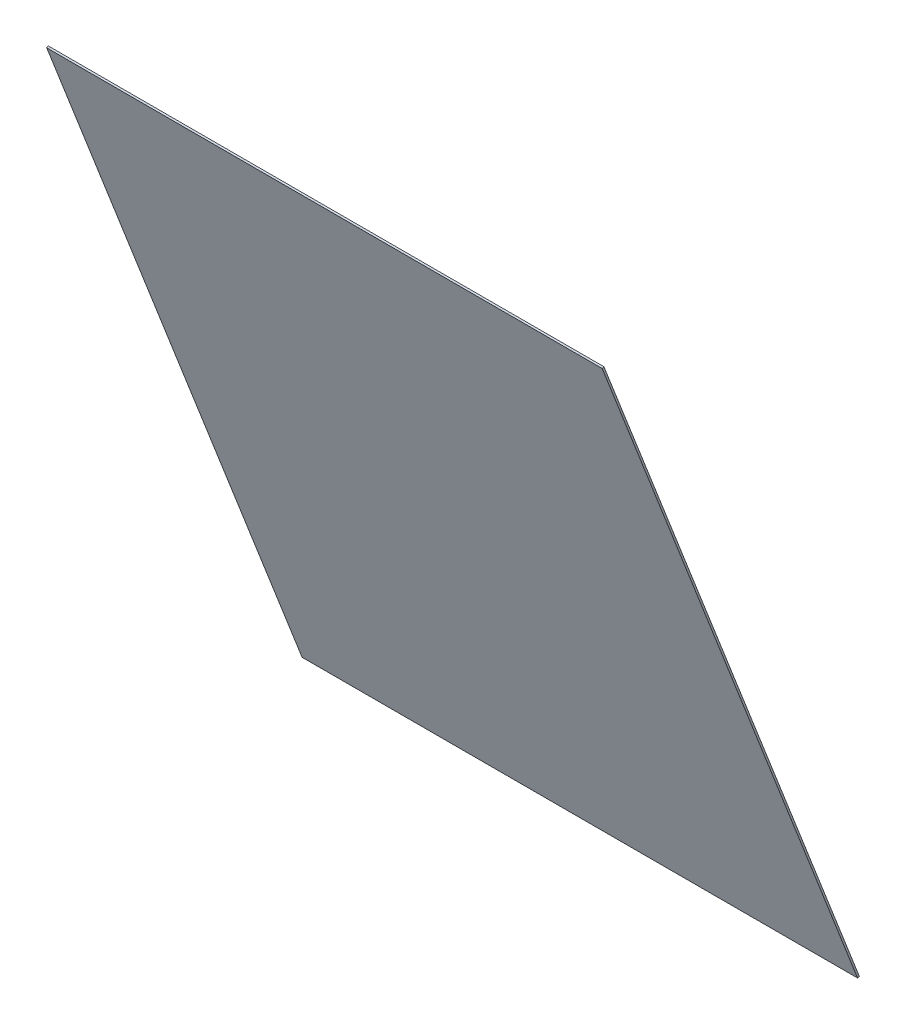
ISO-10303-21;
HEADER;
FILE_DESCRIPTION(('STEP AP214'),'2;1');
FILE_NAME('part.step','',(''),(''),'','','');
FILE_SCHEMA(('AUTOMOTIVE_DESIGN { 1 0 10303 214 1 1 1 1 }'));
ENDSEC;
DATA;
#1=APPLICATION_CONTEXT('core data for automotive mechanical design processes');
#2=APPLICATION_PROTOCOL_DEFINITION('international standard','automotive_design',2000,#1);
#3=PRODUCT_CONTEXT('',#1,'mechanical');
#4=PRODUCT('Part','Part','',(#3));
#5=PRODUCT_RELATED_PRODUCT_CATEGORY('part','',(#4));
#6=PRODUCT_DEFINITION_FORMATION('','',#4);
#7=PRODUCT_DEFINITION_CONTEXT('part definition',#1,'design');
#8=PRODUCT_DEFINITION('design','',#6,#7);
#9=PRODUCT_DEFINITION_SHAPE('','',#8);
#10=(LENGTH_UNIT() NAMED_UNIT(*) SI_UNIT(.MILLI.,.METRE.));
#11=(NAMED_UNIT(*) PLANE_ANGLE_UNIT() SI_UNIT($,.RADIAN.));
#12=(NAMED_UNIT(*) SI_UNIT($,.STERADIAN.) SOLID_ANGLE_UNIT());
#13=UNCERTAINTY_MEASURE_WITH_UNIT(LENGTH_MEASURE(1.E-05),#10,'distance_accuracy_value','');
#14=(GEOMETRIC_REPRESENTATION_CONTEXT(3) GLOBAL_UNCERTAINTY_ASSIGNED_CONTEXT((#13)) GLOBAL_UNIT_ASSIGNED_CONTEXT((#10,
#11,#12)) REPRESENTATION_CONTEXT('',''));
#15=CARTESIAN_POINT('',(0.,0.,0.));
#16=DIRECTION('',(0.,0.,1.));
#17=DIRECTION('',(1.,0.,0.));
#18=AXIS2_PLACEMENT_3D('',#15,#16,#17);
#19=CARTESIAN_POINT('',(0.,39.0189813535358,-50.3039006097775));
#20=DIRECTION('',(-1.,0.,0.));
#21=DIRECTION('',(0.,-0.931790995018928,-0.362995236334632));
#22=AXIS2_PLACEMENT_3D('',#19,#20,#21);
#23=PLANE('',#22);
#24=DIRECTION('',(0.,-0.362995236334632,0.931790995018928));
#25=VECTOR('',#24,1.);
#26=CARTESIAN_POINT('',(0.,39.0189813535358,-50.3039006097775));
#27=LINE('',#26,#25);
#28=CARTESIAN_POINT('',(0.,39.0552808771692,-50.3970797092794));
#29=VERTEX_POINT('',#28);
#30=CARTESIAN_POINT('',(0.,39.0189813535358,-50.3039006097775));
#31=VERTEX_POINT('',#30);
#32=EDGE_CURVE('E11',#29,#31,#27,.T.);
#33=ORIENTED_EDGE('',*,*,#32,.F.);
#34=DIRECTION('',(0.,-0.931790995018928,-0.362995236334632));
#35=VECTOR('',#34,1.);
#36=CARTESIAN_POINT('',(0.,39.0552808771692,-50.3970797092794));
#37=LINE('',#36,#35);
#38=CARTESIAN_POINT('',(0.,3.65028830108417,-64.1897045750314));
#39=VERTEX_POINT('',#38);
#40=EDGE_CURVE('E88',#29,#39,#37,.T.);
#41=ORIENTED_EDGE('',*,*,#40,.T.);
#42=DIRECTION('',(0.,-0.362995236334632,0.931790995018928));
#43=VECTOR('',#42,1.);
#44=CARTESIAN_POINT('',(0.,3.6139887774507,-64.0965254755295));
#45=LINE('',#44,#43);
#46=CARTESIAN_POINT('',(0.,3.6139887774507,-64.0965254755295));
#47=VERTEX_POINT('',#46);
#48=EDGE_CURVE('E43',#39,#47,#45,.T.);
#49=ORIENTED_EDGE('',*,*,#48,.T.);
#50=DIRECTION('',(0.,-0.931790995018928,-0.362995236334632));
#51=VECTOR('',#50,1.);
#52=CARTESIAN_POINT('',(0.,39.0189813535358,-50.3039006097775));
#53=LINE('',#52,#51);
#54=EDGE_CURVE('E101',#31,#47,#53,.T.);
#55=ORIENTED_EDGE('',*,*,#54,.F.);
#56=EDGE_LOOP('',(#33,#41,#49,#55));
#57=FACE_BOUND('',#56,.T.);
#58=ADVANCED_FACE('F33',(#57),#23,.T.);
#59=CARTESIAN_POINT('',(0.,3.6139887774507,-64.0965254755295));
#60=DIRECTION('',(0.,-0.931790995018928,-0.362995236334632));
#61=DIRECTION('',(1.,0.,0.));
#62=AXIS2_PLACEMENT_3D('',#59,#60,#61);
#63=PLANE('',#62);
#64=ORIENTED_EDGE('',*,*,#48,.F.);
#65=DIRECTION('',(1.,0.,0.));
#66=VECTOR('',#65,1.);
#67=CARTESIAN_POINT('',(0.,3.65028830108417,-64.1897045750314));
#68=LINE('',#67,#66);
#69=CARTESIAN_POINT('',(30.,3.65028830108417,-64.1897045750314));
#70=VERTEX_POINT('',#69);
#71=EDGE_CURVE('E95',#39,#70,#68,.T.);
#72=ORIENTED_EDGE('',*,*,#71,.T.);
#73=DIRECTION('',(0.,-0.362995236334632,0.931790995018928));
#74=VECTOR('',#73,1.);
#75=CARTESIAN_POINT('',(30.,3.6139887774507,-64.0965254755295));
#76=LINE('',#75,#74);
#77=CARTESIAN_POINT('',(30.,3.6139887774507,-64.0965254755295));
#78=VERTEX_POINT('',#77);
#79=EDGE_CURVE('E51',#70,#78,#76,.T.);
#80=ORIENTED_EDGE('',*,*,#79,.T.);
#81=DIRECTION('',(1.,0.,0.));
#82=VECTOR('',#81,1.);
#83=CARTESIAN_POINT('',(0.,3.6139887774507,-64.0965254755295));
#84=LINE('',#83,#82);
#85=EDGE_CURVE('E82',#47,#78,#84,.T.);
#86=ORIENTED_EDGE('',*,*,#85,.F.);
#87=EDGE_LOOP('',(#64,#72,#80,#86));
#88=FACE_BOUND('',#87,.T.);
#89=ADVANCED_FACE('F105',(#88),#63,.T.);
#90=CARTESIAN_POINT('',(30.,39.0189813535358,-50.3039006097775));
#91=DIRECTION('',(-1.,0.,0.));
#92=DIRECTION('',(0.,-0.931790995018928,-0.362995236334632));
#93=AXIS2_PLACEMENT_3D('',#90,#91,#92);
#94=PLANE('',#93);
#95=ORIENTED_EDGE('',*,*,#79,.F.);
#96=DIRECTION('',(0.,-0.931790995018928,-0.362995236334632));
#97=VECTOR('',#96,1.);
#98=CARTESIAN_POINT('',(30.,39.0552808771692,-50.3970797092794));
#99=LINE('',#98,#97);
#100=CARTESIAN_POINT('',(30.,39.0552808771692,-50.3970797092794));
#101=VERTEX_POINT('',#100);
#102=EDGE_CURVE('E87',#101,#70,#99,.T.);
#103=ORIENTED_EDGE('',*,*,#102,.F.);
#104=DIRECTION('',(0.,-0.362995236334632,0.931790995018928));
#105=VECTOR('',#104,1.);
#106=CARTESIAN_POINT('',(30.,39.0189813535358,-50.3039006097775));
#107=LINE('',#106,#105);
#108=CARTESIAN_POINT('',(30.,39.0189813535358,-50.3039006097775));
#109=VERTEX_POINT('',#108);
#110=EDGE_CURVE('E37',#101,#109,#107,.T.);
#111=ORIENTED_EDGE('',*,*,#110,.T.);
#112=DIRECTION('',(0.,-0.931790995018928,-0.362995236334632));
#113=VECTOR('',#112,1.);
#114=CARTESIAN_POINT('',(30.,39.0189813535358,-50.3039006097775));
#115=LINE('',#114,#113);
#116=EDGE_CURVE('E97',#109,#78,#115,.T.);
#117=ORIENTED_EDGE('',*,*,#116,.T.);
#118=EDGE_LOOP('',(#95,#103,#111,#117));
#119=FACE_BOUND('',#118,.T.);
#120=ADVANCED_FACE('F90',(#119),#94,.F.);
#121=CARTESIAN_POINT('',(0.,39.0189813535358,-50.3039006097775));
#122=DIRECTION('',(0.,-0.931790995018928,-0.362995236334632));
#123=DIRECTION('',(1.,0.,0.));
#124=AXIS2_PLACEMENT_3D('',#121,#122,#123);
#125=PLANE('',#124);
#126=DIRECTION('',(1.,0.,0.));
#127=VECTOR('',#126,1.);
#128=CARTESIAN_POINT('',(0.,39.0552808771692,-50.3970797092794));
#129=LINE('',#128,#127);
#130=EDGE_CURVE('E76',#29,#101,#129,.T.);
#131=ORIENTED_EDGE('',*,*,#130,.F.);
#132=ORIENTED_EDGE('',*,*,#32,.T.);
#133=DIRECTION('',(1.,0.,0.));
#134=VECTOR('',#133,1.);
#135=CARTESIAN_POINT('',(0.,39.0189813535358,-50.3039006097775));
#136=LINE('',#135,#134);
#137=EDGE_CURVE('E78',#31,#109,#136,.T.);
#138=ORIENTED_EDGE('',*,*,#137,.T.);
#139=ORIENTED_EDGE('',*,*,#110,.F.);
#140=EDGE_LOOP('',(#131,#132,#138,#139));
#141=FACE_BOUND('',#140,.T.);
#142=ADVANCED_FACE('F35',(#141),#125,.F.);
#143=CARTESIAN_POINT('',(0.,39.0189813535358,-50.3039006097775));
#144=DIRECTION('',(0.,-0.362995236334632,0.931790995018928));
#145=DIRECTION('',(0.,-0.931790995018928,-0.362995236334632));
#146=AXIS2_PLACEMENT_3D('',#143,#144,#145);
#147=PLANE('',#146);
#148=ORIENTED_EDGE('',*,*,#116,.F.);
#149=ORIENTED_EDGE('',*,*,#137,.F.);
#150=ORIENTED_EDGE('',*,*,#54,.T.);
#151=ORIENTED_EDGE('',*,*,#85,.T.);
#152=EDGE_LOOP('',(#148,#149,#150,#151));
#153=FACE_BOUND('',#152,.T.);
#154=ADVANCED_FACE('F104',(#153),#147,.T.);
#155=CARTESIAN_POINT('',(0.,39.0552808771692,-50.3970797092794));
#156=DIRECTION('',(0.,-0.362995236334632,0.931790995018928));
#157=DIRECTION('',(0.,-0.931790995018928,-0.362995236334632));
#158=AXIS2_PLACEMENT_3D('',#155,#156,#157);
#159=PLANE('',#158);
#160=ORIENTED_EDGE('',*,*,#102,.T.);
#161=ORIENTED_EDGE('',*,*,#71,.F.);
#162=ORIENTED_EDGE('',*,*,#40,.F.);
#163=ORIENTED_EDGE('',*,*,#130,.T.);
#164=EDGE_LOOP('',(#160,#161,#162,#163));
#165=FACE_BOUND('',#164,.T.);
#166=ADVANCED_FACE('F85',(#165),#159,.F.);
#167=CLOSED_SHELL('',(#58,#89,#120,#142,#154,#166));
#168=MANIFOLD_SOLID_BREP('B2',#167);
#169=ADVANCED_BREP_SHAPE_REPRESENTATION('',(#18,#168),#14);
#170=SHAPE_DEFINITION_REPRESENTATION(#9,#169);
ENDSEC;
END-ISO-10303-21;
